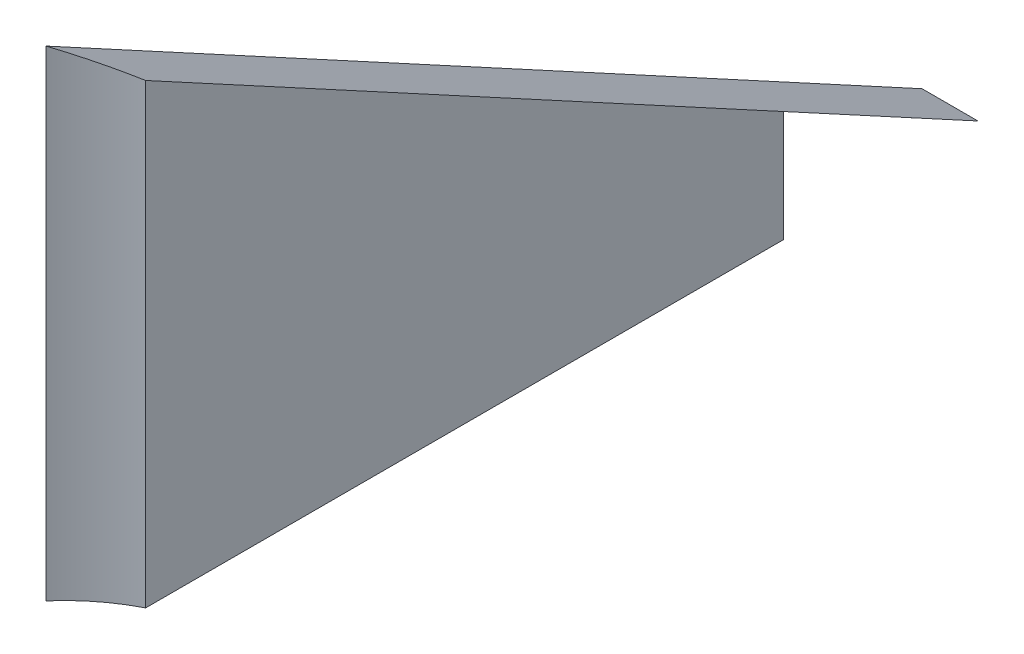
ISO-10303-21;
HEADER;
FILE_DESCRIPTION(('STEP AP214'),'2;1');
FILE_NAME('part.step','',(''),(''),'','','');
FILE_SCHEMA(('AUTOMOTIVE_DESIGN { 1 0 10303 214 1 1 1 1 }'));
ENDSEC;
DATA;
#1=APPLICATION_CONTEXT('core data for automotive mechanical design processes');
#2=APPLICATION_PROTOCOL_DEFINITION('international standard','automotive_design',2000,#1);
#3=PRODUCT_CONTEXT('',#1,'mechanical');
#4=PRODUCT('Part','Part','',(#3));
#5=PRODUCT_RELATED_PRODUCT_CATEGORY('part','',(#4));
#6=PRODUCT_DEFINITION_FORMATION('','',#4);
#7=PRODUCT_DEFINITION_CONTEXT('part definition',#1,'design');
#8=PRODUCT_DEFINITION('design','',#6,#7);
#9=PRODUCT_DEFINITION_SHAPE('','',#8);
#10=(LENGTH_UNIT() NAMED_UNIT(*) SI_UNIT(.MILLI.,.METRE.));
#11=(NAMED_UNIT(*) PLANE_ANGLE_UNIT() SI_UNIT($,.RADIAN.));
#12=(NAMED_UNIT(*) SI_UNIT($,.STERADIAN.) SOLID_ANGLE_UNIT());
#13=UNCERTAINTY_MEASURE_WITH_UNIT(LENGTH_MEASURE(1.E-05),#10,'distance_accuracy_value','');
#14=(GEOMETRIC_REPRESENTATION_CONTEXT(3) GLOBAL_UNCERTAINTY_ASSIGNED_CONTEXT((#13)) GLOBAL_UNIT_ASSIGNED_CONTEXT((#10,
#11,#12)) REPRESENTATION_CONTEXT('',''));
#15=CARTESIAN_POINT('',(0.,0.,0.));
#16=DIRECTION('',(0.,0.,1.));
#17=DIRECTION('',(1.,0.,0.));
#18=AXIS2_PLACEMENT_3D('',#15,#16,#17);
#19=CARTESIAN_POINT('',(3.77,0.,0.));
#20=DIRECTION('',(0.,1.,0.));
#21=DIRECTION('',(0.,0.,1.));
#22=AXIS2_PLACEMENT_3D('',#19,#20,#21);
#23=PLANE('',#22);
#24=DIRECTION('',(0.,0.,-1.));
#25=VECTOR('',#24,1.);
#26=CARTESIAN_POINT('',(0.,0.,0.));
#27=LINE('',#26,#25);
#28=CARTESIAN_POINT('',(0.,0.,-0.257679909194168));
#29=VERTEX_POINT('',#28);
#30=CARTESIAN_POINT('',(0.,0.,-46.1889882674029));
#31=VERTEX_POINT('',#30);
#32=EDGE_CURVE('E116',#29,#31,#27,.T.);
#33=ORIENTED_EDGE('',*,*,#32,.T.);
#34=DIRECTION('',(-1.,0.,0.));
#35=VECTOR('',#34,1.);
#36=CARTESIAN_POINT('',(10.,0.,-46.1889882674029));
#37=LINE('',#36,#35);
#38=CARTESIAN_POINT('',(3.77,0.,-46.1889882674029));
#39=VERTEX_POINT('',#38);
#40=EDGE_CURVE('E71',#39,#31,#37,.T.);
#41=ORIENTED_EDGE('',*,*,#40,.F.);
#42=DIRECTION('',(0.,0.,-1.));
#43=VECTOR('',#42,1.);
#44=CARTESIAN_POINT('',(3.77,0.,0.));
#45=LINE('',#44,#43);
#46=CARTESIAN_POINT('',(3.77,0.,-3.20383309950464));
#47=VERTEX_POINT('',#46);
#48=EDGE_CURVE('E112',#47,#39,#45,.T.);
#49=ORIENTED_EDGE('',*,*,#48,.F.);
#50=CARTESIAN_POINT('',(9.38630502592211,0.,7.86817407425578));
#51=DIRECTION('',(0.,1.,0.));
#52=DIRECTION('',(0.,0.,1.));
#53=AXIS2_PLACEMENT_3D('',#50,#51,#52);
#54=CIRCLE('',#53,12.415);
#55=EDGE_CURVE('E80',#29,#47,#54,.F.);
#56=ORIENTED_EDGE('',*,*,#55,.F.);
#57=EDGE_LOOP('',(#33,#41,#49,#56));
#58=FACE_BOUND('',#57,.T.);
#59=ADVANCED_FACE('F34',(#58),#23,.F.);
#60=CARTESIAN_POINT('',(3.77,32.53,0.));
#61=DIRECTION('',(0.,-0.879107819225435,0.476622955990057));
#62=DIRECTION('',(0.,-0.476622955990057,-0.879107819225435));
#63=AXIS2_PLACEMENT_3D('',#60,#61,#62);
#64=PLANE('',#63);
#65=CARTESIAN_POINT('',(9.38630502592211,36.7958617105923,7.86817407425578));
#66=DIRECTION('',(0.,-0.879107819225435,0.476622955990057));
#67=DIRECTION('',(0.,0.476622955990057,0.879107819225435));
#68=AXIS2_PLACEMENT_3D('',#65,#66,#67);
#69=ELLIPSE('',#68,14.1222722952671,12.415);
#70=CARTESIAN_POINT('',(3.77,30.7929884878852,-3.20383309950464));
#71=VERTEX_POINT('',#70);
#72=CARTESIAN_POINT('',(0.,32.3902945425652,-0.257679909194168));
#73=VERTEX_POINT('',#72);
#74=EDGE_CURVE('E111',#71,#73,#69,.F.);
#75=ORIENTED_EDGE('',*,*,#74,.F.);
#76=DIRECTION('',(0.,0.476622955990057,0.879107819225435));
#77=VECTOR('',#76,1.);
#78=CARTESIAN_POINT('',(3.77,32.53,0.));
#79=LINE('',#78,#77);
#80=CARTESIAN_POINT('',(3.77,0.375821563845087,-59.3068154371133));
#81=VERTEX_POINT('',#80);
#82=EDGE_CURVE('E105',#81,#71,#79,.T.);
#83=ORIENTED_EDGE('',*,*,#82,.F.);
#84=DIRECTION('',(-1.,0.,0.));
#85=VECTOR('',#84,1.);
#86=CARTESIAN_POINT('',(3.77,0.375821563845087,-59.3068154371133));
#87=LINE('',#86,#85);
#88=CARTESIAN_POINT('',(0.,0.375821563845087,-59.3068154371133));
#89=VERTEX_POINT('',#88);
#90=EDGE_CURVE('E109',#81,#89,#87,.T.);
#91=ORIENTED_EDGE('',*,*,#90,.T.);
#92=DIRECTION('',(0.,0.476622955990057,0.879107819225435));
#93=VECTOR('',#92,1.);
#94=CARTESIAN_POINT('',(0.,32.53,0.));
#95=LINE('',#94,#93);
#96=EDGE_CURVE('E115',#89,#73,#95,.T.);
#97=ORIENTED_EDGE('',*,*,#96,.T.);
#98=EDGE_LOOP('',(#75,#83,#91,#97));
#99=FACE_BOUND('',#98,.T.);
#100=ADVANCED_FACE('F107',(#99),#64,.F.);
#101=CARTESIAN_POINT('',(3.77,0.,0.));
#102=DIRECTION('',(-1.,0.,0.));
#103=DIRECTION('',(0.,0.,1.));
#104=AXIS2_PLACEMENT_3D('',#101,#102,#103);
#105=PLANE('',#104);
#106=DIRECTION('',(0.,1.,0.));
#107=VECTOR('',#106,1.);
#108=CARTESIAN_POINT('',(3.77,0.,-46.1889882674029));
#109=LINE('',#108,#107);
#110=CARTESIAN_POINT('',(3.77,7.48784154009227,-46.1889882674029));
#111=VERTEX_POINT('',#110);
#112=EDGE_CURVE('E68',#39,#111,#109,.T.);
#113=ORIENTED_EDGE('',*,*,#112,.T.);
#114=DIRECTION('',(0.,-0.476629241401884,-0.879104411455582));
#115=VECTOR('',#114,1.);
#116=CARTESIAN_POINT('',(3.77,25.1402912347304,-13.6304604819258));
#117=LINE('',#116,#115);
#118=CARTESIAN_POINT('',(3.77,0.372243769544909,-59.3131377044647));
#119=VERTEX_POINT('',#118);
#120=EDGE_CURVE('E52',#111,#119,#117,.T.);
#121=ORIENTED_EDGE('',*,*,#120,.T.);
#122=CARTESIAN_POINT('',(3.77,0.199999999999999,-59.2114908459153));
#123=DIRECTION('',(-1.,0.,0.));
#124=DIRECTION('',(0.,0.,1.));
#125=AXIS2_PLACEMENT_3D('',#122,#123,#124);
#126=CIRCLE('',#125,0.2);
#127=EDGE_CURVE('E103',#119,#81,#126,.F.);
#128=ORIENTED_EDGE('',*,*,#127,.T.);
#129=ORIENTED_EDGE('',*,*,#82,.T.);
#130=DIRECTION('',(0.,1.,0.));
#131=VECTOR('',#130,1.);
#132=CARTESIAN_POINT('',(3.77,-0.112946943088027,-3.20383309950464));
#133=LINE('',#132,#131);
#134=EDGE_CURVE('E89',#47,#71,#133,.T.);
#135=ORIENTED_EDGE('',*,*,#134,.F.);
#136=ORIENTED_EDGE('',*,*,#48,.T.);
#137=EDGE_LOOP('',(#113,#121,#128,#129,#135,#136));
#138=FACE_BOUND('',#137,.T.);
#139=ADVANCED_FACE('F36',(#138),#105,.F.);
#140=CARTESIAN_POINT('',(0.,0.,0.));
#141=DIRECTION('',(-1.,0.,0.));
#142=DIRECTION('',(0.,0.,1.));
#143=AXIS2_PLACEMENT_3D('',#140,#141,#142);
#144=PLANE('',#143);
#145=DIRECTION('',(0.,-0.476629241401884,-0.879104411455582));
#146=VECTOR('',#145,1.);
#147=CARTESIAN_POINT('',(0.,7.48784154009227,-46.1889882674029));
#148=LINE('',#147,#146);
#149=CARTESIAN_POINT('',(0.,7.48784154009227,-46.1889882674029));
#150=VERTEX_POINT('',#149);
#151=CARTESIAN_POINT('',(0.,0.372243769544907,-59.3131377044647));
#152=VERTEX_POINT('',#151);
#153=EDGE_CURVE('E44',#150,#152,#148,.T.);
#154=ORIENTED_EDGE('',*,*,#153,.F.);
#155=DIRECTION('',(0.,1.,0.));
#156=VECTOR('',#155,1.);
#157=CARTESIAN_POINT('',(0.,0.,-46.1889882674029));
#158=LINE('',#157,#156);
#159=EDGE_CURVE('E132',#31,#150,#158,.T.);
#160=ORIENTED_EDGE('',*,*,#159,.F.);
#161=ORIENTED_EDGE('',*,*,#32,.F.);
#162=DIRECTION('',(0.,1.,0.));
#163=VECTOR('',#162,1.);
#164=CARTESIAN_POINT('',(0.,-0.112946943088027,-0.257679909194168));
#165=LINE('',#164,#163);
#166=EDGE_CURVE('E122',#29,#73,#165,.T.);
#167=ORIENTED_EDGE('',*,*,#166,.T.);
#168=ORIENTED_EDGE('',*,*,#96,.F.);
#169=CARTESIAN_POINT('',(0.,0.199999999999999,-59.2114908459153));
#170=DIRECTION('',(-1.,0.,0.));
#171=DIRECTION('',(0.,0.,1.));
#172=AXIS2_PLACEMENT_3D('',#169,#170,#171);
#173=CIRCLE('',#172,0.2);
#174=EDGE_CURVE('E38',#89,#152,#173,.T.);
#175=ORIENTED_EDGE('',*,*,#174,.T.);
#176=EDGE_LOOP('',(#154,#160,#161,#167,#168,#175));
#177=FACE_BOUND('',#176,.T.);
#178=ADVANCED_FACE('F139',(#177),#144,.T.);
#179=CARTESIAN_POINT('',(3.77,0.199999999999999,-59.2114908459153));
#180=DIRECTION('',(-1.,0.,0.));
#181=DIRECTION('',(0.,0.,1.));
#182=AXIS2_PLACEMENT_3D('',#179,#180,#181);
#183=CYLINDRICAL_SURFACE('',#182,0.2);
#184=DIRECTION('',(-1.,0.,0.));
#185=VECTOR('',#184,1.);
#186=CARTESIAN_POINT('',(3.77,0.372243769544945,-59.3131377044646));
#187=LINE('',#186,#185);
#188=EDGE_CURVE('E11',#152,#119,#187,.F.);
#189=ORIENTED_EDGE('',*,*,#188,.F.);
#190=ORIENTED_EDGE('',*,*,#174,.F.);
#191=ORIENTED_EDGE('',*,*,#90,.F.);
#192=ORIENTED_EDGE('',*,*,#127,.F.);
#193=EDGE_LOOP('',(#189,#190,#191,#192));
#194=FACE_BOUND('',#193,.T.);
#195=ADVANCED_FACE('F114',(#194),#183,.T.);
#196=CARTESIAN_POINT('',(9.38630502592211,-0.112946943088027,7.86817407425578));
#197=DIRECTION('',(0.,1.,0.));
#198=DIRECTION('',(0.,0.,1.));
#199=AXIS2_PLACEMENT_3D('',#196,#197,#198);
#200=CYLINDRICAL_SURFACE('',#199,12.415);
#201=ORIENTED_EDGE('',*,*,#134,.T.);
#202=ORIENTED_EDGE('',*,*,#74,.T.);
#203=ORIENTED_EDGE('',*,*,#166,.F.);
#204=ORIENTED_EDGE('',*,*,#55,.T.);
#205=EDGE_LOOP('',(#201,#202,#203,#204));
#206=FACE_BOUND('',#205,.T.);
#207=ADVANCED_FACE('F146',(#206),#200,.F.);
#208=CARTESIAN_POINT('',(10.,0.,-46.1889882674029));
#209=DIRECTION('',(0.,0.,1.));
#210=DIRECTION('',(1.,0.,0.));
#211=AXIS2_PLACEMENT_3D('',#208,#209,#210);
#212=PLANE('',#211);
#213=ORIENTED_EDGE('',*,*,#40,.T.);
#214=ORIENTED_EDGE('',*,*,#159,.T.);
#215=DIRECTION('',(-1.,0.,0.));
#216=VECTOR('',#215,1.);
#217=CARTESIAN_POINT('',(10.,7.48784154009227,-46.1889882674029));
#218=LINE('',#217,#216);
#219=EDGE_CURVE('E61',#111,#150,#218,.T.);
#220=ORIENTED_EDGE('',*,*,#219,.F.);
#221=ORIENTED_EDGE('',*,*,#112,.F.);
#222=EDGE_LOOP('',(#213,#214,#220,#221));
#223=FACE_BOUND('',#222,.T.);
#224=ADVANCED_FACE('F136',(#223),#212,.F.);
#225=CARTESIAN_POINT('',(10.,7.48784154009227,-46.1889882674029));
#226=DIRECTION('',(0.,0.879104411455582,-0.476629241401884));
#227=DIRECTION('',(0.,0.476629241401884,0.879104411455582));
#228=AXIS2_PLACEMENT_3D('',#225,#226,#227);
#229=PLANE('',#228);
#230=ORIENTED_EDGE('',*,*,#219,.T.);
#231=ORIENTED_EDGE('',*,*,#153,.T.);
#232=ORIENTED_EDGE('',*,*,#188,.T.);
#233=ORIENTED_EDGE('',*,*,#120,.F.);
#234=EDGE_LOOP('',(#230,#231,#232,#233));
#235=FACE_BOUND('',#234,.T.);
#236=ADVANCED_FACE('F140',(#235),#229,.F.);
#237=CLOSED_SHELL('',(#59,#100,#139,#178,#195,#207,#224,#236));
#238=MANIFOLD_SOLID_BREP('B2',#237);
#239=ADVANCED_BREP_SHAPE_REPRESENTATION('',(#18,#238),#14);
#240=SHAPE_DEFINITION_REPRESENTATION(#9,#239);
ENDSEC;
END-ISO-10303-21;
